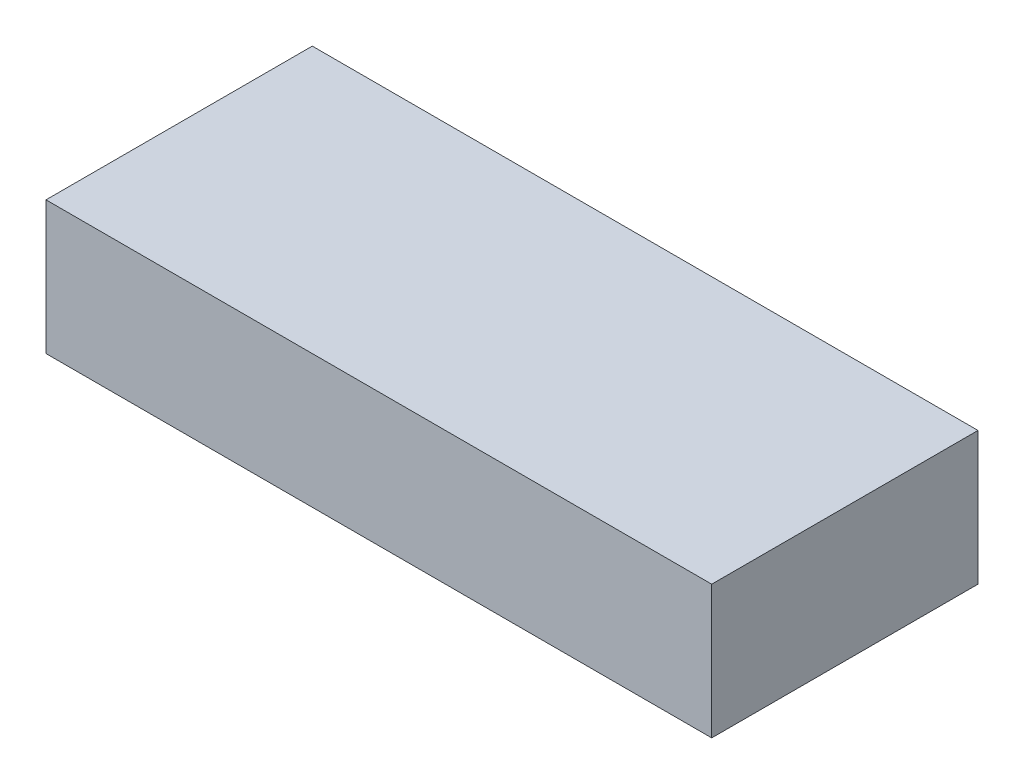
ISO-10303-21;
HEADER;
FILE_DESCRIPTION(('STEP AP214'),'2;1');
FILE_NAME('part.step','',(''),(''),'','','');
FILE_SCHEMA(('AUTOMOTIVE_DESIGN { 1 0 10303 214 1 1 1 1 }'));
ENDSEC;
DATA;
#1=APPLICATION_CONTEXT('core data for automotive mechanical design processes');
#2=APPLICATION_PROTOCOL_DEFINITION('international standard','automotive_design',2000,#1);
#3=PRODUCT_CONTEXT('',#1,'mechanical');
#4=PRODUCT('Part','Part','',(#3));
#5=PRODUCT_RELATED_PRODUCT_CATEGORY('part','',(#4));
#6=PRODUCT_DEFINITION_FORMATION('','',#4);
#7=PRODUCT_DEFINITION_CONTEXT('part definition',#1,'design');
#8=PRODUCT_DEFINITION('design','',#6,#7);
#9=PRODUCT_DEFINITION_SHAPE('','',#8);
#10=(LENGTH_UNIT() NAMED_UNIT(*) SI_UNIT(.MILLI.,.METRE.));
#11=(NAMED_UNIT(*) PLANE_ANGLE_UNIT() SI_UNIT($,.RADIAN.));
#12=(NAMED_UNIT(*) SI_UNIT($,.STERADIAN.) SOLID_ANGLE_UNIT());
#13=UNCERTAINTY_MEASURE_WITH_UNIT(LENGTH_MEASURE(1.E-05),#10,'distance_accuracy_value','');
#14=(GEOMETRIC_REPRESENTATION_CONTEXT(3) GLOBAL_UNCERTAINTY_ASSIGNED_CONTEXT((#13)) GLOBAL_UNIT_ASSIGNED_CONTEXT((#10,
#11,#12)) REPRESENTATION_CONTEXT('',''));
#15=CARTESIAN_POINT('',(0.,0.,0.));
#16=DIRECTION('',(0.,0.,1.));
#17=DIRECTION('',(1.,0.,0.));
#18=AXIS2_PLACEMENT_3D('',#15,#16,#17);
#19=CARTESIAN_POINT('',(500.,200.,200.));
#20=DIRECTION('',(-1.,0.,0.));
#21=DIRECTION('',(0.,0.,1.));
#22=AXIS2_PLACEMENT_3D('',#19,#20,#21);
#23=PLANE('',#22);
#24=DIRECTION('',(0.,0.,-1.));
#25=VECTOR('',#24,1.);
#26=CARTESIAN_POINT('',(500.,0.,200.));
#27=LINE('',#26,#25);
#28=CARTESIAN_POINT('',(500.,0.,200.));
#29=VERTEX_POINT('',#28);
#30=CARTESIAN_POINT('',(500.,0.,-200.));
#31=VERTEX_POINT('',#30);
#32=EDGE_CURVE('E113',#29,#31,#27,.T.);
#33=ORIENTED_EDGE('',*,*,#32,.T.);
#34=DIRECTION('',(0.,-1.,0.));
#35=VECTOR('',#34,1.);
#36=CARTESIAN_POINT('',(500.,200.,-200.));
#37=LINE('',#36,#35);
#38=CARTESIAN_POINT('',(500.,200.,-200.));
#39=VERTEX_POINT('',#38);
#40=EDGE_CURVE('E11',#39,#31,#37,.T.);
#41=ORIENTED_EDGE('',*,*,#40,.F.);
#42=DIRECTION('',(0.,0.,-1.));
#43=VECTOR('',#42,1.);
#44=CARTESIAN_POINT('',(500.,200.,200.));
#45=LINE('',#44,#43);
#46=CARTESIAN_POINT('',(500.,200.,200.));
#47=VERTEX_POINT('',#46);
#48=EDGE_CURVE('E97',#47,#39,#45,.T.);
#49=ORIENTED_EDGE('',*,*,#48,.F.);
#50=DIRECTION('',(0.,-1.,0.));
#51=VECTOR('',#50,1.);
#52=CARTESIAN_POINT('',(500.,200.,200.));
#53=LINE('',#52,#51);
#54=EDGE_CURVE('E109',#47,#29,#53,.T.);
#55=ORIENTED_EDGE('',*,*,#54,.T.);
#56=EDGE_LOOP('',(#33,#41,#49,#55));
#57=FACE_BOUND('',#56,.T.);
#58=ADVANCED_FACE('F45',(#57),#23,.F.);
#59=CARTESIAN_POINT('',(-500.,200.,-200.));
#60=DIRECTION('',(0.,0.,1.));
#61=DIRECTION('',(1.,0.,0.));
#62=AXIS2_PLACEMENT_3D('',#59,#60,#61);
#63=PLANE('',#62);
#64=DIRECTION('',(-1.,0.,0.));
#65=VECTOR('',#64,1.);
#66=CARTESIAN_POINT('',(-500.,0.,-200.));
#67=LINE('',#66,#65);
#68=CARTESIAN_POINT('',(-500.,0.,-200.));
#69=VERTEX_POINT('',#68);
#70=EDGE_CURVE('E102',#31,#69,#67,.T.);
#71=ORIENTED_EDGE('',*,*,#70,.T.);
#72=DIRECTION('',(0.,-1.,0.));
#73=VECTOR('',#72,1.);
#74=CARTESIAN_POINT('',(-500.,200.,-200.));
#75=LINE('',#74,#73);
#76=CARTESIAN_POINT('',(-500.,200.,-200.));
#77=VERTEX_POINT('',#76);
#78=EDGE_CURVE('E54',#77,#69,#75,.T.);
#79=ORIENTED_EDGE('',*,*,#78,.F.);
#80=DIRECTION('',(-1.,0.,0.));
#81=VECTOR('',#80,1.);
#82=CARTESIAN_POINT('',(-500.,200.,-200.));
#83=LINE('',#82,#81);
#84=EDGE_CURVE('E92',#39,#77,#83,.T.);
#85=ORIENTED_EDGE('',*,*,#84,.F.);
#86=ORIENTED_EDGE('',*,*,#40,.T.);
#87=EDGE_LOOP('',(#71,#79,#85,#86));
#88=FACE_BOUND('',#87,.T.);
#89=ADVANCED_FACE('F101',(#88),#63,.F.);
#90=CARTESIAN_POINT('',(-500.,200.,200.));
#91=DIRECTION('',(1.,0.,0.));
#92=DIRECTION('',(0.,0.,-1.));
#93=AXIS2_PLACEMENT_3D('',#90,#91,#92);
#94=PLANE('',#93);
#95=DIRECTION('',(0.,0.,1.));
#96=VECTOR('',#95,1.);
#97=CARTESIAN_POINT('',(-500.,0.,200.));
#98=LINE('',#97,#96);
#99=CARTESIAN_POINT('',(-500.,0.,200.));
#100=VERTEX_POINT('',#99);
#101=EDGE_CURVE('E79',#69,#100,#98,.T.);
#102=ORIENTED_EDGE('',*,*,#101,.T.);
#103=DIRECTION('',(0.,-1.,0.));
#104=VECTOR('',#103,1.);
#105=CARTESIAN_POINT('',(-500.,200.,200.));
#106=LINE('',#105,#104);
#107=CARTESIAN_POINT('',(-500.,200.,200.));
#108=VERTEX_POINT('',#107);
#109=EDGE_CURVE('E104',#108,#100,#106,.T.);
#110=ORIENTED_EDGE('',*,*,#109,.F.);
#111=DIRECTION('',(0.,0.,1.));
#112=VECTOR('',#111,1.);
#113=CARTESIAN_POINT('',(-500.,200.,200.));
#114=LINE('',#113,#112);
#115=EDGE_CURVE('E95',#77,#108,#114,.T.);
#116=ORIENTED_EDGE('',*,*,#115,.F.);
#117=ORIENTED_EDGE('',*,*,#78,.T.);
#118=EDGE_LOOP('',(#102,#110,#116,#117));
#119=FACE_BOUND('',#118,.T.);
#120=ADVANCED_FACE('F105',(#119),#94,.F.);
#121=CARTESIAN_POINT('',(-500.,200.,200.));
#122=DIRECTION('',(0.,0.,-1.));
#123=DIRECTION('',(-1.,0.,0.));
#124=AXIS2_PLACEMENT_3D('',#121,#122,#123);
#125=PLANE('',#124);
#126=DIRECTION('',(1.,0.,0.));
#127=VECTOR('',#126,1.);
#128=CARTESIAN_POINT('',(-500.,0.,200.));
#129=LINE('',#128,#127);
#130=EDGE_CURVE('E85',#100,#29,#129,.T.);
#131=ORIENTED_EDGE('',*,*,#130,.T.);
#132=ORIENTED_EDGE('',*,*,#54,.F.);
#133=DIRECTION('',(1.,0.,0.));
#134=VECTOR('',#133,1.);
#135=CARTESIAN_POINT('',(-500.,200.,200.));
#136=LINE('',#135,#134);
#137=EDGE_CURVE('E62',#108,#47,#136,.T.);
#138=ORIENTED_EDGE('',*,*,#137,.F.);
#139=ORIENTED_EDGE('',*,*,#109,.T.);
#140=EDGE_LOOP('',(#131,#132,#138,#139));
#141=FACE_BOUND('',#140,.T.);
#142=ADVANCED_FACE('F126',(#141),#125,.F.);
#143=CARTESIAN_POINT('',(0.,200.,0.));
#144=DIRECTION('',(0.,-1.,0.));
#145=DIRECTION('',(0.,0.,-1.));
#146=AXIS2_PLACEMENT_3D('',#143,#144,#145);
#147=PLANE('',#146);
#148=ORIENTED_EDGE('',*,*,#48,.T.);
#149=ORIENTED_EDGE('',*,*,#84,.T.);
#150=ORIENTED_EDGE('',*,*,#115,.T.);
#151=ORIENTED_EDGE('',*,*,#137,.T.);
#152=EDGE_LOOP('',(#148,#149,#150,#151));
#153=FACE_BOUND('',#152,.T.);
#154=ADVANCED_FACE('F93',(#153),#147,.F.);
#155=CARTESIAN_POINT('',(0.,0.,0.));
#156=DIRECTION('',(0.,-1.,0.));
#157=DIRECTION('',(0.,0.,-1.));
#158=AXIS2_PLACEMENT_3D('',#155,#156,#157);
#159=PLANE('',#158);
#160=ORIENTED_EDGE('',*,*,#32,.F.);
#161=ORIENTED_EDGE('',*,*,#130,.F.);
#162=ORIENTED_EDGE('',*,*,#101,.F.);
#163=ORIENTED_EDGE('',*,*,#70,.F.);
#164=EDGE_LOOP('',(#160,#161,#162,#163));
#165=FACE_BOUND('',#164,.T.);
#166=ADVANCED_FACE('F129',(#165),#159,.T.);
#167=CLOSED_SHELL('',(#58,#89,#120,#142,#154,#166));
#168=MANIFOLD_SOLID_BREP('B2',#167);
#169=ADVANCED_BREP_SHAPE_REPRESENTATION('',(#18,#168),#14);
#170=SHAPE_DEFINITION_REPRESENTATION(#9,#169);
ENDSEC;
END-ISO-10303-21;
